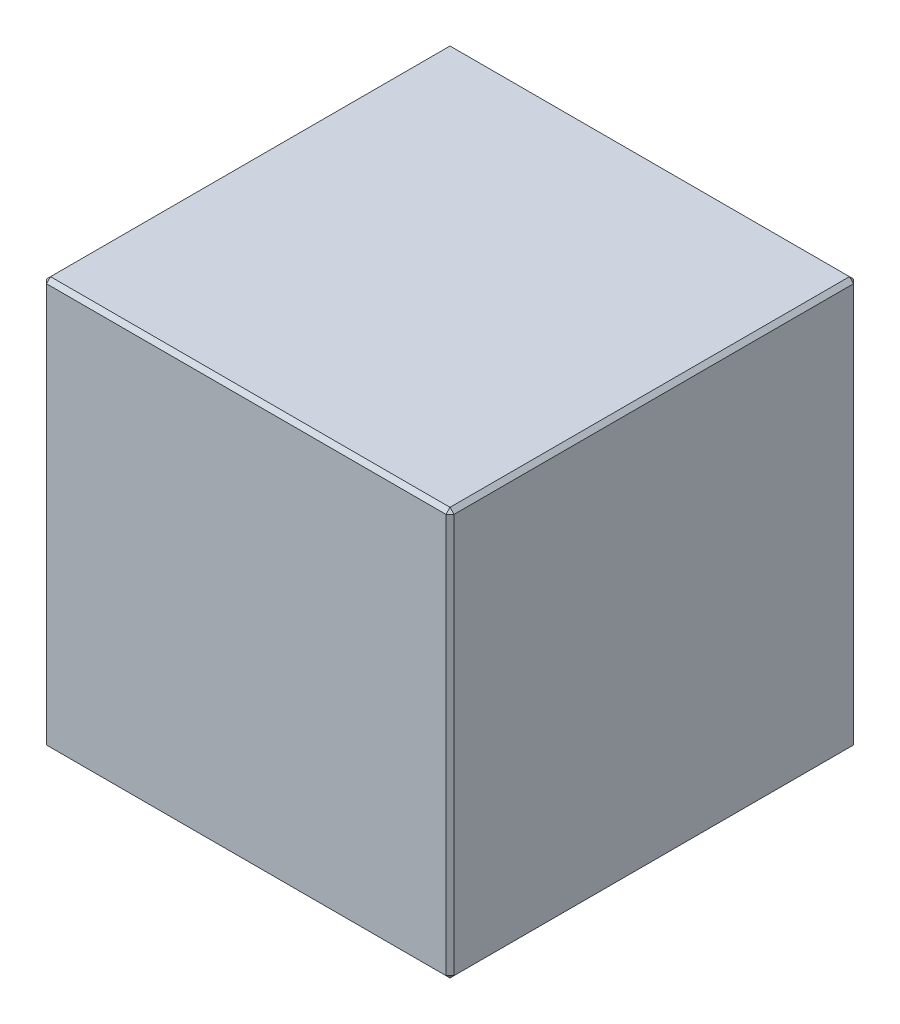
ISO-10303-21;
HEADER;
FILE_DESCRIPTION(('STEP AP214'),'2;1');
FILE_NAME('part.step','',(''),(''),'','','');
FILE_SCHEMA(('AUTOMOTIVE_DESIGN { 1 0 10303 214 1 1 1 1 }'));
ENDSEC;
DATA;
#1=APPLICATION_CONTEXT('core data for automotive mechanical design processes');
#2=APPLICATION_PROTOCOL_DEFINITION('international standard','automotive_design',2000,#1);
#3=PRODUCT_CONTEXT('',#1,'mechanical');
#4=PRODUCT('Part','Part','',(#3));
#5=PRODUCT_RELATED_PRODUCT_CATEGORY('part','',(#4));
#6=PRODUCT_DEFINITION_FORMATION('','',#4);
#7=PRODUCT_DEFINITION_CONTEXT('part definition',#1,'design');
#8=PRODUCT_DEFINITION('design','',#6,#7);
#9=PRODUCT_DEFINITION_SHAPE('','',#8);
#10=(LENGTH_UNIT() NAMED_UNIT(*) SI_UNIT(.MILLI.,.METRE.));
#11=(NAMED_UNIT(*) PLANE_ANGLE_UNIT() SI_UNIT($,.RADIAN.));
#12=(NAMED_UNIT(*) SI_UNIT($,.STERADIAN.) SOLID_ANGLE_UNIT());
#13=UNCERTAINTY_MEASURE_WITH_UNIT(LENGTH_MEASURE(1.E-05),#10,'distance_accuracy_value','');
#14=(GEOMETRIC_REPRESENTATION_CONTEXT(3) GLOBAL_UNCERTAINTY_ASSIGNED_CONTEXT((#13)) GLOBAL_UNIT_ASSIGNED_CONTEXT((#10,
#11,#12)) REPRESENTATION_CONTEXT('',''));
#15=CARTESIAN_POINT('',(0.,0.,0.));
#16=DIRECTION('',(0.,0.,1.));
#17=DIRECTION('',(1.,0.,0.));
#18=AXIS2_PLACEMENT_3D('',#15,#16,#17);
#19=CARTESIAN_POINT('',(0.,60.,0.));
#20=DIRECTION('',(1.,0.,0.));
#21=DIRECTION('',(0.,0.,-1.));
#22=AXIS2_PLACEMENT_3D('',#19,#20,#21);
#23=PLANE('',#22);
#24=DIRECTION('',(0.,-1.,0.));
#25=VECTOR('',#24,1.);
#26=CARTESIAN_POINT('',(0.,60.,-59.4));
#27=LINE('',#26,#25);
#28=CARTESIAN_POINT('',(0.,59.4,-59.4));
#29=VERTEX_POINT('',#28);
#30=CARTESIAN_POINT('',(0.,0.600000000000003,-59.4));
#31=VERTEX_POINT('',#30);
#32=EDGE_CURVE('E182',#29,#31,#27,.T.);
#33=ORIENTED_EDGE('',*,*,#32,.T.);
#34=DIRECTION('',(0.,0.,1.));
#35=VECTOR('',#34,1.);
#36=CARTESIAN_POINT('',(0.,0.600000000000003,0.));
#37=LINE('',#36,#35);
#38=CARTESIAN_POINT('',(0.,0.600000000000003,-0.600000000000003));
#39=VERTEX_POINT('',#38);
#40=EDGE_CURVE('E184',#31,#39,#37,.T.);
#41=ORIENTED_EDGE('',*,*,#40,.T.);
#42=DIRECTION('',(0.,1.,0.));
#43=VECTOR('',#42,1.);
#44=CARTESIAN_POINT('',(0.,60.,-0.600000000000003));
#45=LINE('',#44,#43);
#46=CARTESIAN_POINT('',(0.,59.4,-0.600000000000003));
#47=VERTEX_POINT('',#46);
#48=EDGE_CURVE('E178',#39,#47,#45,.T.);
#49=ORIENTED_EDGE('',*,*,#48,.T.);
#50=DIRECTION('',(0.,0.,-1.));
#51=VECTOR('',#50,1.);
#52=CARTESIAN_POINT('',(0.,59.4,0.));
#53=LINE('',#52,#51);
#54=EDGE_CURVE('E180',#47,#29,#53,.T.);
#55=ORIENTED_EDGE('',*,*,#54,.T.);
#56=EDGE_LOOP('',(#33,#41,#49,#55));
#57=FACE_BOUND('',#56,.T.);
#58=ADVANCED_FACE('F37',(#57),#23,.F.);
#59=CARTESIAN_POINT('',(0.,60.,0.));
#60=DIRECTION('',(0.,0.,-1.));
#61=DIRECTION('',(-1.,0.,0.));
#62=AXIS2_PLACEMENT_3D('',#59,#60,#61);
#63=PLANE('',#62);
#64=DIRECTION('',(-1.,0.,0.));
#65=VECTOR('',#64,1.);
#66=CARTESIAN_POINT('',(0.,59.4,0.));
#67=LINE('',#66,#65);
#68=CARTESIAN_POINT('',(59.4,59.4,0.));
#69=VERTEX_POINT('',#68);
#70=CARTESIAN_POINT('',(0.600000000000003,59.4,0.));
#71=VERTEX_POINT('',#70);
#72=EDGE_CURVE('E47',#69,#71,#67,.T.);
#73=ORIENTED_EDGE('',*,*,#72,.T.);
#74=DIRECTION('',(0.,-1.,0.));
#75=VECTOR('',#74,1.);
#76=CARTESIAN_POINT('',(0.600000000000003,60.,0.));
#77=LINE('',#76,#75);
#78=CARTESIAN_POINT('',(0.600000000000003,0.600000000000003,0.));
#79=VERTEX_POINT('',#78);
#80=EDGE_CURVE('E11',#71,#79,#77,.T.);
#81=ORIENTED_EDGE('',*,*,#80,.T.);
#82=DIRECTION('',(1.,0.,0.));
#83=VECTOR('',#82,1.);
#84=CARTESIAN_POINT('',(60.,0.600000000000003,0.));
#85=LINE('',#84,#83);
#86=CARTESIAN_POINT('',(59.4,0.600000000000003,0.));
#87=VERTEX_POINT('',#86);
#88=EDGE_CURVE('E203',#79,#87,#85,.T.);
#89=ORIENTED_EDGE('',*,*,#88,.T.);
#90=DIRECTION('',(0.,1.,0.));
#91=VECTOR('',#90,1.);
#92=CARTESIAN_POINT('',(59.4,60.,0.));
#93=LINE('',#92,#91);
#94=EDGE_CURVE('E58',#87,#69,#93,.T.);
#95=ORIENTED_EDGE('',*,*,#94,.T.);
#96=EDGE_LOOP('',(#73,#81,#89,#95));
#97=FACE_BOUND('',#96,.T.);
#98=ADVANCED_FACE('F312',(#97),#63,.F.);
#99=CARTESIAN_POINT('',(60.,60.,0.));
#100=DIRECTION('',(-1.,0.,0.));
#101=DIRECTION('',(0.,0.,1.));
#102=AXIS2_PLACEMENT_3D('',#99,#100,#101);
#103=PLANE('',#102);
#104=DIRECTION('',(0.,0.,-1.));
#105=VECTOR('',#104,1.);
#106=CARTESIAN_POINT('',(60.,0.600000000000003,-60.));
#107=LINE('',#106,#105);
#108=CARTESIAN_POINT('',(60.,0.600000000000003,-0.600000000000003));
#109=VERTEX_POINT('',#108);
#110=CARTESIAN_POINT('',(60.,0.600000000000003,-59.4));
#111=VERTEX_POINT('',#110);
#112=EDGE_CURVE('E137',#109,#111,#107,.T.);
#113=ORIENTED_EDGE('',*,*,#112,.T.);
#114=DIRECTION('',(0.,1.,0.));
#115=VECTOR('',#114,1.);
#116=CARTESIAN_POINT('',(60.,60.,-59.4));
#117=LINE('',#116,#115);
#118=CARTESIAN_POINT('',(60.,59.4,-59.4));
#119=VERTEX_POINT('',#118);
#120=EDGE_CURVE('E133',#111,#119,#117,.T.);
#121=ORIENTED_EDGE('',*,*,#120,.T.);
#122=DIRECTION('',(0.,0.,1.));
#123=VECTOR('',#122,1.);
#124=CARTESIAN_POINT('',(60.,59.4,0.));
#125=LINE('',#124,#123);
#126=CARTESIAN_POINT('',(60.,59.4,-0.600000000000003));
#127=VERTEX_POINT('',#126);
#128=EDGE_CURVE('E125',#119,#127,#125,.T.);
#129=ORIENTED_EDGE('',*,*,#128,.T.);
#130=DIRECTION('',(0.,-1.,0.));
#131=VECTOR('',#130,1.);
#132=CARTESIAN_POINT('',(60.,60.,-0.600000000000003));
#133=LINE('',#132,#131);
#134=EDGE_CURVE('E130',#127,#109,#133,.T.);
#135=ORIENTED_EDGE('',*,*,#134,.T.);
#136=EDGE_LOOP('',(#113,#121,#129,#135));
#137=FACE_BOUND('',#136,.T.);
#138=ADVANCED_FACE('F128',(#137),#103,.F.);
#139=CARTESIAN_POINT('',(0.,60.,-60.));
#140=DIRECTION('',(0.,0.,1.));
#141=DIRECTION('',(1.,0.,0.));
#142=AXIS2_PLACEMENT_3D('',#139,#140,#141);
#143=PLANE('',#142);
#144=DIRECTION('',(1.,0.,0.));
#145=VECTOR('',#144,1.);
#146=CARTESIAN_POINT('',(0.,59.4,-60.));
#147=LINE('',#146,#145);
#148=CARTESIAN_POINT('',(0.59999999999999,59.4,-60.));
#149=VERTEX_POINT('',#148);
#150=CARTESIAN_POINT('',(59.4,59.4,-60.));
#151=VERTEX_POINT('',#150);
#152=EDGE_CURVE('E198',#149,#151,#147,.T.);
#153=ORIENTED_EDGE('',*,*,#152,.T.);
#154=DIRECTION('',(0.,-1.,0.));
#155=VECTOR('',#154,1.);
#156=CARTESIAN_POINT('',(59.4,60.,-60.));
#157=LINE('',#156,#155);
#158=CARTESIAN_POINT('',(59.4,0.600000000000003,-60.));
#159=VERTEX_POINT('',#158);
#160=EDGE_CURVE('E200',#151,#159,#157,.T.);
#161=ORIENTED_EDGE('',*,*,#160,.T.);
#162=DIRECTION('',(-1.,0.,0.));
#163=VECTOR('',#162,1.);
#164=CARTESIAN_POINT('',(0.,0.600000000000003,-60.));
#165=LINE('',#164,#163);
#166=CARTESIAN_POINT('',(0.59999999999999,0.600000000000003,-60.));
#167=VERTEX_POINT('',#166);
#168=EDGE_CURVE('E196',#159,#167,#165,.T.);
#169=ORIENTED_EDGE('',*,*,#168,.T.);
#170=DIRECTION('',(0.,1.,0.));
#171=VECTOR('',#170,1.);
#172=CARTESIAN_POINT('',(0.59999999999999,60.,-60.));
#173=LINE('',#172,#171);
#174=EDGE_CURVE('E194',#167,#149,#173,.T.);
#175=ORIENTED_EDGE('',*,*,#174,.T.);
#176=EDGE_LOOP('',(#153,#161,#169,#175));
#177=FACE_BOUND('',#176,.T.);
#178=ADVANCED_FACE('F269',(#177),#143,.F.);
#179=CARTESIAN_POINT('',(0.,60.,0.));
#180=DIRECTION('',(0.,-1.,0.));
#181=DIRECTION('',(0.,0.,-1.));
#182=AXIS2_PLACEMENT_3D('',#179,#180,#181);
#183=PLANE('',#182);
#184=DIRECTION('',(1.,0.,0.));
#185=VECTOR('',#184,1.);
#186=CARTESIAN_POINT('',(0.,60.,-0.600000000000003));
#187=LINE('',#186,#185);
#188=CARTESIAN_POINT('',(0.600000000000003,60.,-0.600000000000003));
#189=VERTEX_POINT('',#188);
#190=CARTESIAN_POINT('',(59.4,60.,-0.600000000000003));
#191=VERTEX_POINT('',#190);
#192=EDGE_CURVE('E187',#189,#191,#187,.T.);
#193=ORIENTED_EDGE('',*,*,#192,.T.);
#194=DIRECTION('',(0.,0.,-1.));
#195=VECTOR('',#194,1.);
#196=CARTESIAN_POINT('',(59.4,60.,0.));
#197=LINE('',#196,#195);
#198=CARTESIAN_POINT('',(59.4,60.,-59.4));
#199=VERTEX_POINT('',#198);
#200=EDGE_CURVE('E145',#191,#199,#197,.T.);
#201=ORIENTED_EDGE('',*,*,#200,.T.);
#202=DIRECTION('',(-1.,0.,0.));
#203=VECTOR('',#202,1.);
#204=CARTESIAN_POINT('',(0.,60.,-59.4));
#205=LINE('',#204,#203);
#206=CARTESIAN_POINT('',(0.59999999999999,60.,-59.4));
#207=VERTEX_POINT('',#206);
#208=EDGE_CURVE('E191',#199,#207,#205,.T.);
#209=ORIENTED_EDGE('',*,*,#208,.T.);
#210=DIRECTION('',(0.,0.,1.));
#211=VECTOR('',#210,1.);
#212=CARTESIAN_POINT('',(0.600000000000003,60.,0.));
#213=LINE('',#212,#211);
#214=EDGE_CURVE('E189',#207,#189,#213,.T.);
#215=ORIENTED_EDGE('',*,*,#214,.T.);
#216=EDGE_LOOP('',(#193,#201,#209,#215));
#217=FACE_BOUND('',#216,.T.);
#218=ADVANCED_FACE('F300',(#217),#183,.F.);
#219=CARTESIAN_POINT('',(0.,0.,0.));
#220=DIRECTION('',(0.,-1.,0.));
#221=DIRECTION('',(0.,0.,-1.));
#222=AXIS2_PLACEMENT_3D('',#219,#220,#221);
#223=PLANE('',#222);
#224=DIRECTION('',(0.,0.,-1.));
#225=VECTOR('',#224,1.);
#226=CARTESIAN_POINT('',(0.599999999999989,0.,-60.));
#227=LINE('',#226,#225);
#228=CARTESIAN_POINT('',(0.600000000000003,0.,-0.600000000000003));
#229=VERTEX_POINT('',#228);
#230=CARTESIAN_POINT('',(0.59999999999999,0.,-59.4));
#231=VERTEX_POINT('',#230);
#232=EDGE_CURVE('E171',#229,#231,#227,.T.);
#233=ORIENTED_EDGE('',*,*,#232,.T.);
#234=DIRECTION('',(1.,0.,0.));
#235=VECTOR('',#234,1.);
#236=CARTESIAN_POINT('',(60.,0.,-59.4));
#237=LINE('',#236,#235);
#238=CARTESIAN_POINT('',(59.4,0.,-59.4));
#239=VERTEX_POINT('',#238);
#240=EDGE_CURVE('E176',#231,#239,#237,.T.);
#241=ORIENTED_EDGE('',*,*,#240,.T.);
#242=DIRECTION('',(0.,0.,1.));
#243=VECTOR('',#242,1.);
#244=CARTESIAN_POINT('',(59.4,0.,0.));
#245=LINE('',#244,#243);
#246=CARTESIAN_POINT('',(59.4,0.,-0.600000000000003));
#247=VERTEX_POINT('',#246);
#248=EDGE_CURVE('E173',#239,#247,#245,.T.);
#249=ORIENTED_EDGE('',*,*,#248,.T.);
#250=DIRECTION('',(-1.,0.,0.));
#251=VECTOR('',#250,1.);
#252=CARTESIAN_POINT('',(0.,0.,-0.600000000000003));
#253=LINE('',#252,#251);
#254=EDGE_CURVE('E169',#247,#229,#253,.T.);
#255=ORIENTED_EDGE('',*,*,#254,.T.);
#256=EDGE_LOOP('',(#233,#241,#249,#255));
#257=FACE_BOUND('',#256,.T.);
#258=ADVANCED_FACE('F302',(#257),#223,.T.);
#259=CARTESIAN_POINT('',(0.600000000000003,60.,0.));
#260=DIRECTION('',(0.707106781186548,-0.707106781186548,0.));
#261=DIRECTION('',(0.,0.,1.));
#262=AXIS2_PLACEMENT_3D('',#259,#260,#261);
#263=PLANE('',#262);
#264=DIRECTION('',(0.707106781186547,0.707106781186547,0.));
#265=VECTOR('',#264,1.);
#266=CARTESIAN_POINT('',(0.600000000000003,60.,-0.600000000000003));
#267=LINE('',#266,#265);
#268=EDGE_CURVE('E42',#189,#47,#267,.F.);
#269=ORIENTED_EDGE('',*,*,#268,.F.);
#270=ORIENTED_EDGE('',*,*,#214,.F.);
#271=DIRECTION('',(-0.707106781186548,-0.707106781186548,0.));
#272=VECTOR('',#271,1.);
#273=CARTESIAN_POINT('',(0.59999999999999,60.,-59.4));
#274=LINE('',#273,#272);
#275=EDGE_CURVE('E165',#29,#207,#274,.F.);
#276=ORIENTED_EDGE('',*,*,#275,.F.);
#277=ORIENTED_EDGE('',*,*,#54,.F.);
#278=EDGE_LOOP('',(#269,#270,#276,#277));
#279=FACE_BOUND('',#278,.T.);
#280=ADVANCED_FACE('F40',(#279),#263,.F.);
#281=CARTESIAN_POINT('',(0.600000000000003,60.,-0.600000000000003));
#282=DIRECTION('',(-0.577350269189626,0.577350269189626,0.577350269189626));
#283=DIRECTION('',(0.,-0.707106781186547,0.707106781186547));
#284=AXIS2_PLACEMENT_3D('',#281,#282,#283);
#285=PLANE('',#284);
#286=DIRECTION('',(0.,-0.707106781186548,0.707106781186548));
#287=VECTOR('',#286,1.);
#288=CARTESIAN_POINT('',(0.600000000000003,60.,-0.600000000000003));
#289=LINE('',#288,#287);
#290=EDGE_CURVE('E248',#189,#71,#289,.T.);
#291=ORIENTED_EDGE('',*,*,#290,.F.);
#292=ORIENTED_EDGE('',*,*,#268,.T.);
#293=DIRECTION('',(-0.707106781186547,0.,-0.707106781186547));
#294=VECTOR('',#293,1.);
#295=CARTESIAN_POINT('',(0.300000000000002,59.4,-0.300000000000002));
#296=LINE('',#295,#294);
#297=EDGE_CURVE('E250',#71,#47,#296,.T.);
#298=ORIENTED_EDGE('',*,*,#297,.F.);
#299=EDGE_LOOP('',(#291,#292,#298));
#300=FACE_BOUND('',#299,.T.);
#301=ADVANCED_FACE('F295',(#300),#285,.T.);
#302=CARTESIAN_POINT('',(0.59999999999999,60.,-59.4));
#303=DIRECTION('',(-0.577350269189626,0.577350269189626,-0.577350269189626));
#304=DIRECTION('',(-0.707106781186547,0.,0.707106781186547));
#305=AXIS2_PLACEMENT_3D('',#302,#303,#304);
#306=PLANE('',#305);
#307=DIRECTION('',(0.707106781186547,0.,-0.707106781186547));
#308=VECTOR('',#307,1.);
#309=CARTESIAN_POINT('',(0.299999999999988,59.4,-59.7));
#310=LINE('',#309,#308);
#311=EDGE_CURVE('E242',#29,#149,#310,.T.);
#312=ORIENTED_EDGE('',*,*,#311,.F.);
#313=ORIENTED_EDGE('',*,*,#275,.T.);
#314=DIRECTION('',(0.,0.707106781186547,0.707106781186547));
#315=VECTOR('',#314,1.);
#316=CARTESIAN_POINT('',(0.59999999999999,60.,-59.4));
#317=LINE('',#316,#315);
#318=EDGE_CURVE('E245',#149,#207,#317,.T.);
#319=ORIENTED_EDGE('',*,*,#318,.F.);
#320=EDGE_LOOP('',(#312,#313,#319));
#321=FACE_BOUND('',#320,.T.);
#322=ADVANCED_FACE('F257',(#321),#306,.T.);
#323=CARTESIAN_POINT('',(0.600000000000003,60.,0.));
#324=DIRECTION('',(0.707106781186547,0.,-0.707106781186548));
#325=DIRECTION('',(0.,-1.,0.));
#326=AXIS2_PLACEMENT_3D('',#323,#324,#325);
#327=PLANE('',#326);
#328=ORIENTED_EDGE('',*,*,#297,.T.);
#329=ORIENTED_EDGE('',*,*,#48,.F.);
#330=DIRECTION('',(0.707106781186547,0.,0.707106781186547));
#331=VECTOR('',#330,1.);
#332=CARTESIAN_POINT('',(0.,0.600000000000003,-0.600000000000003));
#333=LINE('',#332,#331);
#334=EDGE_CURVE('E237',#79,#39,#333,.F.);
#335=ORIENTED_EDGE('',*,*,#334,.F.);
#336=ORIENTED_EDGE('',*,*,#80,.F.);
#337=EDGE_LOOP('',(#328,#329,#335,#336));
#338=FACE_BOUND('',#337,.T.);
#339=ADVANCED_FACE('F289',(#338),#327,.F.);
#340=CARTESIAN_POINT('',(0.,60.,-0.600000000000003));
#341=DIRECTION('',(0.,-0.707106781186548,-0.707106781186548));
#342=DIRECTION('',(1.,0.,0.));
#343=AXIS2_PLACEMENT_3D('',#340,#341,#342);
#344=PLANE('',#343);
#345=ORIENTED_EDGE('',*,*,#290,.T.);
#346=ORIENTED_EDGE('',*,*,#72,.F.);
#347=DIRECTION('',(0.,0.707106781186547,-0.707106781186547));
#348=VECTOR('',#347,1.);
#349=CARTESIAN_POINT('',(59.4,59.7,-0.300000000000002));
#350=LINE('',#349,#348);
#351=EDGE_CURVE('E149',#191,#69,#350,.F.);
#352=ORIENTED_EDGE('',*,*,#351,.F.);
#353=ORIENTED_EDGE('',*,*,#192,.F.);
#354=EDGE_LOOP('',(#345,#346,#352,#353));
#355=FACE_BOUND('',#354,.T.);
#356=ADVANCED_FACE('F298',(#355),#344,.F.);
#357=CARTESIAN_POINT('',(59.4,60.,0.));
#358=DIRECTION('',(-0.707106781186548,-0.707106781186548,0.));
#359=DIRECTION('',(0.,0.,-1.));
#360=AXIS2_PLACEMENT_3D('',#357,#358,#359);
#361=PLANE('',#360);
#362=DIRECTION('',(-0.707106781186547,0.707106781186547,0.));
#363=VECTOR('',#362,1.);
#364=CARTESIAN_POINT('',(59.4,60.,-59.4));
#365=LINE('',#364,#363);
#366=EDGE_CURVE('E150',#199,#119,#365,.F.);
#367=ORIENTED_EDGE('',*,*,#366,.F.);
#368=ORIENTED_EDGE('',*,*,#200,.F.);
#369=DIRECTION('',(0.707106781186548,-0.707106781186548,0.));
#370=VECTOR('',#369,1.);
#371=CARTESIAN_POINT('',(60.,59.4,-0.600000000000003));
#372=LINE('',#371,#370);
#373=EDGE_CURVE('E141',#127,#191,#372,.F.);
#374=ORIENTED_EDGE('',*,*,#373,.F.);
#375=ORIENTED_EDGE('',*,*,#128,.F.);
#376=EDGE_LOOP('',(#367,#368,#374,#375));
#377=FACE_BOUND('',#376,.T.);
#378=ADVANCED_FACE('F143',(#377),#361,.F.);
#379=CARTESIAN_POINT('',(0.,60.,-59.4));
#380=DIRECTION('',(0.,-0.707106781186548,0.707106781186548));
#381=DIRECTION('',(-1.,0.,0.));
#382=AXIS2_PLACEMENT_3D('',#379,#380,#381);
#383=PLANE('',#382);
#384=ORIENTED_EDGE('',*,*,#318,.T.);
#385=ORIENTED_EDGE('',*,*,#208,.F.);
#386=DIRECTION('',(0.,-0.707106781186547,-0.707106781186547));
#387=VECTOR('',#386,1.);
#388=CARTESIAN_POINT('',(59.4,60.,-59.4));
#389=LINE('',#388,#387);
#390=EDGE_CURVE('E233',#151,#199,#389,.F.);
#391=ORIENTED_EDGE('',*,*,#390,.F.);
#392=ORIENTED_EDGE('',*,*,#152,.F.);
#393=EDGE_LOOP('',(#384,#385,#391,#392));
#394=FACE_BOUND('',#393,.T.);
#395=ADVANCED_FACE('F265',(#394),#383,.F.);
#396=CARTESIAN_POINT('',(0.,60.,-59.4));
#397=DIRECTION('',(0.707106781186548,0.,0.707106781186548));
#398=DIRECTION('',(0.,-1.,0.));
#399=AXIS2_PLACEMENT_3D('',#396,#397,#398);
#400=PLANE('',#399);
#401=ORIENTED_EDGE('',*,*,#311,.T.);
#402=ORIENTED_EDGE('',*,*,#174,.F.);
#403=DIRECTION('',(-0.707106781186547,0.,0.707106781186547));
#404=VECTOR('',#403,1.);
#405=CARTESIAN_POINT('',(0.299999999999988,0.600000000000003,-59.7));
#406=LINE('',#405,#404);
#407=EDGE_CURVE('E230',#31,#167,#406,.F.);
#408=ORIENTED_EDGE('',*,*,#407,.F.);
#409=ORIENTED_EDGE('',*,*,#32,.F.);
#410=EDGE_LOOP('',(#401,#402,#408,#409));
#411=FACE_BOUND('',#410,.T.);
#412=ADVANCED_FACE('F275',(#411),#400,.F.);
#413=CARTESIAN_POINT('',(0.,0.600000000000003,0.));
#414=DIRECTION('',(-0.707106781186548,-0.707106781186548,0.));
#415=DIRECTION('',(0.,0.,-1.));
#416=AXIS2_PLACEMENT_3D('',#413,#414,#415);
#417=PLANE('',#416);
#418=DIRECTION('',(0.707106781186547,-0.707106781186547,0.));
#419=VECTOR('',#418,1.);
#420=CARTESIAN_POINT('',(0.,0.600000000000003,-0.600000000000003));
#421=LINE('',#420,#419);
#422=EDGE_CURVE('E239',#39,#229,#421,.T.);
#423=ORIENTED_EDGE('',*,*,#422,.F.);
#424=ORIENTED_EDGE('',*,*,#40,.F.);
#425=DIRECTION('',(-0.707106781186548,0.707106781186548,0.));
#426=VECTOR('',#425,1.);
#427=CARTESIAN_POINT('',(0.59999999999999,0.,-59.4));
#428=LINE('',#427,#426);
#429=EDGE_CURVE('E227',#231,#31,#428,.T.);
#430=ORIENTED_EDGE('',*,*,#429,.F.);
#431=ORIENTED_EDGE('',*,*,#232,.F.);
#432=EDGE_LOOP('',(#423,#424,#430,#431));
#433=FACE_BOUND('',#432,.T.);
#434=ADVANCED_FACE('F281',(#433),#417,.T.);
#435=CARTESIAN_POINT('',(0.,0.600000000000003,-0.600000000000003));
#436=DIRECTION('',(-0.577350269189626,-0.577350269189626,0.577350269189626));
#437=DIRECTION('',(0.,-0.707106781186547,-0.707106781186547));
#438=AXIS2_PLACEMENT_3D('',#435,#436,#437);
#439=PLANE('',#438);
#440=ORIENTED_EDGE('',*,*,#334,.T.);
#441=ORIENTED_EDGE('',*,*,#422,.T.);
#442=DIRECTION('',(0.,0.707106781186548,0.707106781186548));
#443=VECTOR('',#442,1.);
#444=CARTESIAN_POINT('',(0.600000000000003,0.300000000000002,-0.300000000000002));
#445=LINE('',#444,#443);
#446=EDGE_CURVE('E156',#79,#229,#445,.F.);
#447=ORIENTED_EDGE('',*,*,#446,.F.);
#448=EDGE_LOOP('',(#440,#441,#447));
#449=FACE_BOUND('',#448,.T.);
#450=ADVANCED_FACE('F387',(#449),#439,.T.);
#451=CARTESIAN_POINT('',(60.,59.4,-0.600000000000003));
#452=DIRECTION('',(0.577350269189626,0.577350269189626,0.577350269189626));
#453=DIRECTION('',(0.707106781186547,0.,-0.707106781186547));
#454=AXIS2_PLACEMENT_3D('',#451,#452,#453);
#455=PLANE('',#454);
#456=ORIENTED_EDGE('',*,*,#373,.T.);
#457=ORIENTED_EDGE('',*,*,#351,.T.);
#458=DIRECTION('',(-0.707106781186547,0.,0.707106781186548));
#459=VECTOR('',#458,1.);
#460=CARTESIAN_POINT('',(60.,59.4,-0.600000000000003));
#461=LINE('',#460,#459);
#462=EDGE_CURVE('E153',#127,#69,#461,.T.);
#463=ORIENTED_EDGE('',*,*,#462,.F.);
#464=EDGE_LOOP('',(#456,#457,#463));
#465=FACE_BOUND('',#464,.T.);
#466=ADVANCED_FACE('F154',(#465),#455,.T.);
#467=CARTESIAN_POINT('',(59.4,60.,-59.4));
#468=DIRECTION('',(0.577350269189626,0.577350269189626,-0.577350269189626));
#469=DIRECTION('',(-0.707106781186547,0.,-0.707106781186547));
#470=AXIS2_PLACEMENT_3D('',#467,#468,#469);
#471=PLANE('',#470);
#472=ORIENTED_EDGE('',*,*,#390,.T.);
#473=ORIENTED_EDGE('',*,*,#366,.T.);
#474=DIRECTION('',(0.707106781186547,0.,0.707106781186547));
#475=VECTOR('',#474,1.);
#476=CARTESIAN_POINT('',(59.7,59.4,-59.7));
#477=LINE('',#476,#475);
#478=EDGE_CURVE('E157',#151,#119,#477,.T.);
#479=ORIENTED_EDGE('',*,*,#478,.F.);
#480=EDGE_LOOP('',(#472,#473,#479));
#481=FACE_BOUND('',#480,.T.);
#482=ADVANCED_FACE('F374',(#481),#471,.T.);
#483=CARTESIAN_POINT('',(0.59999999999999,0.,-59.4));
#484=DIRECTION('',(-0.577350269189626,-0.577350269189626,-0.577350269189626));
#485=DIRECTION('',(-0.707106781186547,0.,0.707106781186547));
#486=AXIS2_PLACEMENT_3D('',#483,#484,#485);
#487=PLANE('',#486);
#488=ORIENTED_EDGE('',*,*,#429,.T.);
#489=ORIENTED_EDGE('',*,*,#407,.T.);
#490=DIRECTION('',(0.,-0.707106781186547,0.707106781186547));
#491=VECTOR('',#490,1.);
#492=CARTESIAN_POINT('',(0.59999999999999,0.,-59.4));
#493=LINE('',#492,#491);
#494=EDGE_CURVE('E220',#231,#167,#493,.F.);
#495=ORIENTED_EDGE('',*,*,#494,.F.);
#496=EDGE_LOOP('',(#488,#489,#495));
#497=FACE_BOUND('',#496,.T.);
#498=ADVANCED_FACE('F367',(#497),#487,.T.);
#499=CARTESIAN_POINT('',(0.,0.600000000000003,0.));
#500=DIRECTION('',(0.,-0.707106781186548,0.707106781186548));
#501=DIRECTION('',(-1.,0.,0.));
#502=AXIS2_PLACEMENT_3D('',#499,#500,#501);
#503=PLANE('',#502);
#504=ORIENTED_EDGE('',*,*,#446,.T.);
#505=ORIENTED_EDGE('',*,*,#254,.F.);
#506=DIRECTION('',(0.,-0.707106781186547,-0.707106781186547));
#507=VECTOR('',#506,1.);
#508=CARTESIAN_POINT('',(59.4,0.,-0.600000000000003));
#509=LINE('',#508,#507);
#510=EDGE_CURVE('E217',#87,#247,#509,.T.);
#511=ORIENTED_EDGE('',*,*,#510,.F.);
#512=ORIENTED_EDGE('',*,*,#88,.F.);
#513=EDGE_LOOP('',(#504,#505,#511,#512));
#514=FACE_BOUND('',#513,.T.);
#515=ADVANCED_FACE('F361',(#514),#503,.T.);
#516=CARTESIAN_POINT('',(60.,60.,-0.600000000000003));
#517=DIRECTION('',(-0.707106781186547,0.,-0.707106781186547));
#518=DIRECTION('',(0.,-1.,0.));
#519=AXIS2_PLACEMENT_3D('',#516,#517,#518);
#520=PLANE('',#519);
#521=ORIENTED_EDGE('',*,*,#462,.T.);
#522=ORIENTED_EDGE('',*,*,#94,.F.);
#523=DIRECTION('',(0.707106781186547,0.,-0.707106781186548));
#524=VECTOR('',#523,1.);
#525=CARTESIAN_POINT('',(59.7,0.600000000000003,-0.300000000000002));
#526=LINE('',#525,#524);
#527=EDGE_CURVE('E161',#109,#87,#526,.F.);
#528=ORIENTED_EDGE('',*,*,#527,.F.);
#529=ORIENTED_EDGE('',*,*,#134,.F.);
#530=EDGE_LOOP('',(#521,#522,#528,#529));
#531=FACE_BOUND('',#530,.T.);
#532=ADVANCED_FACE('F159',(#531),#520,.F.);
#533=CARTESIAN_POINT('',(59.4,60.,-60.));
#534=DIRECTION('',(-0.707106781186548,0.,0.707106781186548));
#535=DIRECTION('',(0.,-1.,0.));
#536=AXIS2_PLACEMENT_3D('',#533,#534,#535);
#537=PLANE('',#536);
#538=ORIENTED_EDGE('',*,*,#478,.T.);
#539=ORIENTED_EDGE('',*,*,#120,.F.);
#540=DIRECTION('',(-0.707106781186547,0.,-0.707106781186547));
#541=VECTOR('',#540,1.);
#542=CARTESIAN_POINT('',(60.,0.600000000000003,-59.4));
#543=LINE('',#542,#541);
#544=EDGE_CURVE('E213',#159,#111,#543,.F.);
#545=ORIENTED_EDGE('',*,*,#544,.F.);
#546=ORIENTED_EDGE('',*,*,#160,.F.);
#547=EDGE_LOOP('',(#538,#539,#545,#546));
#548=FACE_BOUND('',#547,.T.);
#549=ADVANCED_FACE('F348',(#548),#537,.F.);
#550=CARTESIAN_POINT('',(0.,0.600000000000003,-60.));
#551=DIRECTION('',(0.,-0.707106781186548,-0.707106781186548));
#552=DIRECTION('',(1.,0.,0.));
#553=AXIS2_PLACEMENT_3D('',#550,#551,#552);
#554=PLANE('',#553);
#555=ORIENTED_EDGE('',*,*,#494,.T.);
#556=ORIENTED_EDGE('',*,*,#168,.F.);
#557=DIRECTION('',(0.,0.707106781186547,-0.707106781186547));
#558=VECTOR('',#557,1.);
#559=CARTESIAN_POINT('',(59.4,0.300000000000002,-59.7));
#560=LINE('',#559,#558);
#561=EDGE_CURVE('E211',#239,#159,#560,.T.);
#562=ORIENTED_EDGE('',*,*,#561,.F.);
#563=ORIENTED_EDGE('',*,*,#240,.F.);
#564=EDGE_LOOP('',(#555,#556,#562,#563));
#565=FACE_BOUND('',#564,.T.);
#566=ADVANCED_FACE('F341',(#565),#554,.T.);
#567=CARTESIAN_POINT('',(59.4,0.,-0.600000000000003));
#568=DIRECTION('',(0.577350269189626,-0.577350269189626,0.577350269189626));
#569=DIRECTION('',(0.707106781186547,0.,-0.707106781186547));
#570=AXIS2_PLACEMENT_3D('',#567,#568,#569);
#571=PLANE('',#570);
#572=ORIENTED_EDGE('',*,*,#527,.T.);
#573=ORIENTED_EDGE('',*,*,#510,.T.);
#574=DIRECTION('',(0.707106781186548,0.707106781186548,0.));
#575=VECTOR('',#574,1.);
#576=CARTESIAN_POINT('',(59.4,0.,-0.600000000000003));
#577=LINE('',#576,#575);
#578=EDGE_CURVE('E209',#109,#247,#577,.F.);
#579=ORIENTED_EDGE('',*,*,#578,.F.);
#580=EDGE_LOOP('',(#572,#573,#579));
#581=FACE_BOUND('',#580,.T.);
#582=ADVANCED_FACE('F334',(#581),#571,.T.);
#583=CARTESIAN_POINT('',(60.,0.600000000000003,-59.4));
#584=DIRECTION('',(0.577350269189626,-0.577350269189626,-0.577350269189626));
#585=DIRECTION('',(-0.707106781186547,0.,-0.707106781186547));
#586=AXIS2_PLACEMENT_3D('',#583,#584,#585);
#587=PLANE('',#586);
#588=ORIENTED_EDGE('',*,*,#561,.T.);
#589=ORIENTED_EDGE('',*,*,#544,.T.);
#590=DIRECTION('',(-0.707106781186547,-0.707106781186547,0.));
#591=VECTOR('',#590,1.);
#592=CARTESIAN_POINT('',(60.,0.600000000000003,-59.4));
#593=LINE('',#592,#591);
#594=EDGE_CURVE('E207',#239,#111,#593,.F.);
#595=ORIENTED_EDGE('',*,*,#594,.F.);
#596=EDGE_LOOP('',(#588,#589,#595));
#597=FACE_BOUND('',#596,.T.);
#598=ADVANCED_FACE('F327',(#597),#587,.T.);
#599=CARTESIAN_POINT('',(60.,0.600000000000003,0.));
#600=DIRECTION('',(0.707106781186548,-0.707106781186548,0.));
#601=DIRECTION('',(0.,0.,1.));
#602=AXIS2_PLACEMENT_3D('',#599,#600,#601);
#603=PLANE('',#602);
#604=ORIENTED_EDGE('',*,*,#578,.T.);
#605=ORIENTED_EDGE('',*,*,#248,.F.);
#606=ORIENTED_EDGE('',*,*,#594,.T.);
#607=ORIENTED_EDGE('',*,*,#112,.F.);
#608=EDGE_LOOP('',(#604,#605,#606,#607));
#609=FACE_BOUND('',#608,.T.);
#610=ADVANCED_FACE('F321',(#609),#603,.T.);
#611=CLOSED_SHELL('',(#58,#98,#138,#178,#218,#258,#280,#301,#322,#339,#356,#378,#395,#412,#434,
#450,#466,#482,#498,#515,#532,#549,#566,#582,#598,#610));
#612=MANIFOLD_SOLID_BREP('B2',#611);
#613=ADVANCED_BREP_SHAPE_REPRESENTATION('',(#18,#612),#14);
#614=SHAPE_DEFINITION_REPRESENTATION(#9,#613);
ENDSEC;
END-ISO-10303-21;
